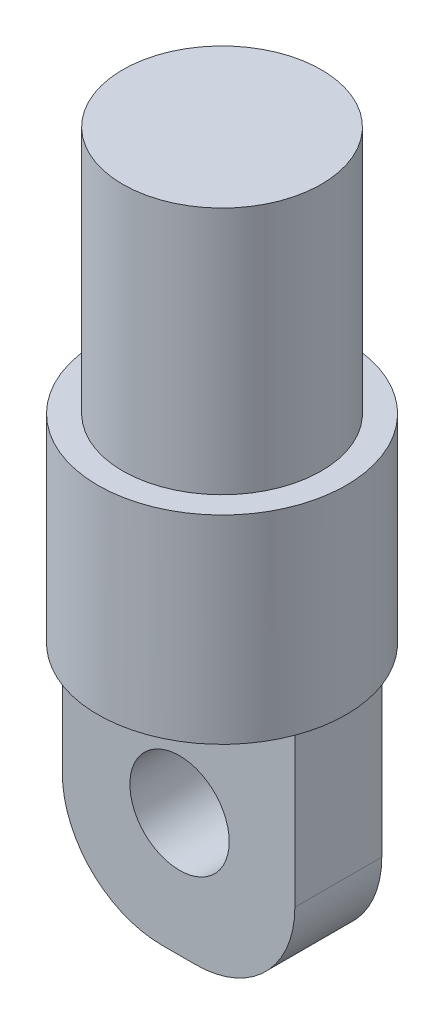
ISO-10303-21;
HEADER;
FILE_DESCRIPTION(('STEP AP214'),'2;1');
FILE_NAME('part.step','',(''),(''),'','','');
FILE_SCHEMA(('AUTOMOTIVE_DESIGN { 1 0 10303 214 1 1 1 1 }'));
ENDSEC;
DATA;
#1=APPLICATION_CONTEXT('core data for automotive mechanical design processes');
#2=APPLICATION_PROTOCOL_DEFINITION('international standard','automotive_design',2000,#1);
#3=PRODUCT_CONTEXT('',#1,'mechanical');
#4=PRODUCT('Part','Part','',(#3));
#5=PRODUCT_RELATED_PRODUCT_CATEGORY('part','',(#4));
#6=PRODUCT_DEFINITION_FORMATION('','',#4);
#7=PRODUCT_DEFINITION_CONTEXT('part definition',#1,'design');
#8=PRODUCT_DEFINITION('design','',#6,#7);
#9=PRODUCT_DEFINITION_SHAPE('','',#8);
#10=(LENGTH_UNIT() NAMED_UNIT(*) SI_UNIT(.MILLI.,.METRE.));
#11=(NAMED_UNIT(*) PLANE_ANGLE_UNIT() SI_UNIT($,.RADIAN.));
#12=(NAMED_UNIT(*) SI_UNIT($,.STERADIAN.) SOLID_ANGLE_UNIT());
#13=UNCERTAINTY_MEASURE_WITH_UNIT(LENGTH_MEASURE(1.E-05),#10,'distance_accuracy_value','');
#14=(GEOMETRIC_REPRESENTATION_CONTEXT(3) GLOBAL_UNCERTAINTY_ASSIGNED_CONTEXT((#13)) GLOBAL_UNIT_ASSIGNED_CONTEXT((#10,
#11,#12)) REPRESENTATION_CONTEXT('',''));
#15=CARTESIAN_POINT('',(0.,0.,0.));
#16=DIRECTION('',(0.,0.,1.));
#17=DIRECTION('',(1.,0.,0.));
#18=AXIS2_PLACEMENT_3D('',#15,#16,#17);
#19=CARTESIAN_POINT('',(0.,0.,0.));
#20=DIRECTION('',(0.,1.,0.));
#21=DIRECTION('',(0.,0.,1.));
#22=AXIS2_PLACEMENT_3D('',#19,#20,#21);
#23=PLANE('',#22);
#24=DIRECTION('',(0.,0.,1.));
#25=VECTOR('',#24,1.);
#26=CARTESIAN_POINT('',(29.7403777212003,0.,-11.1163138225011));
#27=LINE('',#26,#25);
#28=CARTESIAN_POINT('',(29.7403777212004,0.,-11.1163138225011));
#29=VERTEX_POINT('',#28);
#30=CARTESIAN_POINT('',(29.7403777212004,0.,11.1163138225011));
#31=VERTEX_POINT('',#30);
#32=EDGE_CURVE('E142',#29,#31,#27,.T.);
#33=ORIENTED_EDGE('',*,*,#32,.F.);
#34=CARTESIAN_POINT('',(0.,0.,0.));
#35=DIRECTION('',(0.,1.,0.));
#36=DIRECTION('',(0.,0.,1.));
#37=AXIS2_PLACEMENT_3D('',#34,#35,#36);
#38=CIRCLE('',#37,31.75);
#39=EDGE_CURVE('E135',#31,#29,#38,.T.);
#40=ORIENTED_EDGE('',*,*,#39,.F.);
#41=EDGE_LOOP('',(#33,#40));
#42=FACE_BOUND('',#41,.T.);
#43=ADVANCED_FACE('F47',(#42),#23,.F.);
#44=DIRECTION('',(1.,0.,0.));
#45=VECTOR('',#44,1.);
#46=CARTESIAN_POINT('',(-29.7403777212004,0.,-11.1163138225011));
#47=LINE('',#46,#45);
#48=CARTESIAN_POINT('',(-29.7403777212004,0.,-11.1163138225011));
#49=VERTEX_POINT('',#48);
#50=EDGE_CURVE('E138',#49,#29,#47,.T.);
#51=ORIENTED_EDGE('',*,*,#50,.F.);
#52=EDGE_CURVE('E125',#29,#49,#38,.T.);
#53=ORIENTED_EDGE('',*,*,#52,.F.);
#54=EDGE_LOOP('',(#51,#53));
#55=FACE_BOUND('',#54,.T.);
#56=ADVANCED_FACE('F223',(#55),#23,.F.);
#57=DIRECTION('',(0.,0.,-1.));
#58=VECTOR('',#57,1.);
#59=CARTESIAN_POINT('',(-29.7403777212004,0.,-11.1163138225011));
#60=LINE('',#59,#58);
#61=CARTESIAN_POINT('',(-29.7403777212004,0.,11.1163138225011));
#62=VERTEX_POINT('',#61);
#63=EDGE_CURVE('E104',#62,#49,#60,.T.);
#64=ORIENTED_EDGE('',*,*,#63,.F.);
#65=EDGE_CURVE('E118',#49,#62,#38,.T.);
#66=ORIENTED_EDGE('',*,*,#65,.F.);
#67=EDGE_LOOP('',(#64,#66));
#68=FACE_BOUND('',#67,.T.);
#69=ADVANCED_FACE('F136',(#68),#23,.F.);
#70=DIRECTION('',(-1.,0.,0.));
#71=VECTOR('',#70,1.);
#72=CARTESIAN_POINT('',(-29.7403777212004,0.,11.1163138225011));
#73=LINE('',#72,#71);
#74=EDGE_CURVE('E132',#31,#62,#73,.T.);
#75=ORIENTED_EDGE('',*,*,#74,.F.);
#76=EDGE_CURVE('E122',#62,#31,#38,.T.);
#77=ORIENTED_EDGE('',*,*,#76,.F.);
#78=EDGE_LOOP('',(#75,#77));
#79=FACE_BOUND('',#78,.T.);
#80=ADVANCED_FACE('F131',(#79),#23,.F.);
#81=CARTESIAN_POINT('',(0.,50.8,0.));
#82=DIRECTION('',(0.,-1.,0.));
#83=DIRECTION('',(0.,0.,-1.));
#84=AXIS2_PLACEMENT_3D('',#81,#82,#83);
#85=CYLINDRICAL_SURFACE('',#84,31.75);
#86=CARTESIAN_POINT('',(0.,50.8,0.));
#87=DIRECTION('',(0.,1.,0.));
#88=DIRECTION('',(0.,0.,1.));
#89=AXIS2_PLACEMENT_3D('',#86,#87,#88);
#90=CIRCLE('',#89,31.75);
#91=CARTESIAN_POINT('',(0.,50.8,31.75));
#92=VERTEX_POINT('',#91);
#93=EDGE_CURVE('E170',#92,#92,#90,.T.);
#94=ORIENTED_EDGE('',*,*,#93,.F.);
#95=EDGE_LOOP('',(#94));
#96=FACE_BOUND('',#95,.T.);
#97=ORIENTED_EDGE('',*,*,#39,.T.);
#98=ORIENTED_EDGE('',*,*,#52,.T.);
#99=ORIENTED_EDGE('',*,*,#65,.T.);
#100=ORIENTED_EDGE('',*,*,#76,.T.);
#101=EDGE_LOOP('',(#97,#98,#99,#100));
#102=FACE_BOUND('',#101,.T.);
#103=ADVANCED_FACE('F121',(#96,#102),#85,.T.);
#104=CARTESIAN_POINT('',(0.,50.8,0.));
#105=DIRECTION('',(0.,1.,0.));
#106=DIRECTION('',(0.,0.,1.));
#107=AXIS2_PLACEMENT_3D('',#104,#105,#106);
#108=PLANE('',#107);
#109=CARTESIAN_POINT('',(0.,50.8,0.));
#110=DIRECTION('',(0.,1.,0.));
#111=DIRECTION('',(0.,0.,1.));
#112=AXIS2_PLACEMENT_3D('',#109,#110,#111);
#113=CIRCLE('',#112,25.4);
#114=CARTESIAN_POINT('',(0.,50.8,25.4));
#115=VERTEX_POINT('',#114);
#116=EDGE_CURVE('E165',#115,#115,#113,.T.);
#117=ORIENTED_EDGE('',*,*,#116,.F.);
#118=EDGE_LOOP('',(#117));
#119=FACE_BOUND('',#118,.T.);
#120=ORIENTED_EDGE('',*,*,#93,.T.);
#121=EDGE_LOOP('',(#120));
#122=FACE_BOUND('',#121,.T.);
#123=ADVANCED_FACE('F239',(#119,#122),#108,.T.);
#124=CARTESIAN_POINT('',(0.,114.3,0.));
#125=DIRECTION('',(0.,-1.,0.));
#126=DIRECTION('',(0.,0.,-1.));
#127=AXIS2_PLACEMENT_3D('',#124,#125,#126);
#128=CYLINDRICAL_SURFACE('',#127,25.4);
#129=CARTESIAN_POINT('',(0.,114.3,0.));
#130=DIRECTION('',(0.,1.,0.));
#131=DIRECTION('',(0.,0.,1.));
#132=AXIS2_PLACEMENT_3D('',#129,#130,#131);
#133=CIRCLE('',#132,25.4);
#134=CARTESIAN_POINT('',(0.,114.3,25.4));
#135=VERTEX_POINT('',#134);
#136=EDGE_CURVE('E134',#135,#135,#133,.T.);
#137=ORIENTED_EDGE('',*,*,#136,.F.);
#138=EDGE_LOOP('',(#137));
#139=FACE_BOUND('',#138,.T.);
#140=ORIENTED_EDGE('',*,*,#116,.T.);
#141=EDGE_LOOP('',(#140));
#142=FACE_BOUND('',#141,.T.);
#143=ADVANCED_FACE('F331',(#139,#142),#128,.T.);
#144=CARTESIAN_POINT('',(0.,114.3,0.));
#145=DIRECTION('',(0.,1.,0.));
#146=DIRECTION('',(0.,0.,1.));
#147=AXIS2_PLACEMENT_3D('',#144,#145,#146);
#148=PLANE('',#147);
#149=ORIENTED_EDGE('',*,*,#136,.T.);
#150=EDGE_LOOP('',(#149));
#151=FACE_BOUND('',#150,.T.);
#152=ADVANCED_FACE('F220',(#151),#148,.T.);
#153=CARTESIAN_POINT('',(29.7403777212003,-63.5,-11.1163138225011));
#154=DIRECTION('',(-1.,0.,0.));
#155=DIRECTION('',(0.,0.,1.));
#156=AXIS2_PLACEMENT_3D('',#153,#154,#155);
#157=PLANE('',#156);
#158=DIRECTION('',(0.,1.,0.));
#159=VECTOR('',#158,1.);
#160=CARTESIAN_POINT('',(29.7403777212003,-63.5,11.1163138225011));
#161=LINE('',#160,#159);
#162=CARTESIAN_POINT('',(29.7403777212003,-38.1,11.1163138225011));
#163=VERTEX_POINT('',#162);
#164=EDGE_CURVE('E111',#163,#31,#161,.T.);
#165=ORIENTED_EDGE('',*,*,#164,.F.);
#166=DIRECTION('',(0.,0.,1.));
#167=VECTOR('',#166,1.);
#168=CARTESIAN_POINT('',(29.7403777212003,-38.1,-11.1163138225011));
#169=LINE('',#168,#167);
#170=CARTESIAN_POINT('',(29.7403777212003,-38.1,-11.1163138225011));
#171=VERTEX_POINT('',#170);
#172=EDGE_CURVE('E56',#163,#171,#169,.F.);
#173=ORIENTED_EDGE('',*,*,#172,.T.);
#174=DIRECTION('',(0.,1.,0.));
#175=VECTOR('',#174,1.);
#176=CARTESIAN_POINT('',(29.7403777212003,-63.5,-11.1163138225011));
#177=LINE('',#176,#175);
#178=EDGE_CURVE('E154',#171,#29,#177,.T.);
#179=ORIENTED_EDGE('',*,*,#178,.T.);
#180=ORIENTED_EDGE('',*,*,#32,.T.);
#181=EDGE_LOOP('',(#165,#173,#179,#180));
#182=FACE_BOUND('',#181,.T.);
#183=ADVANCED_FACE('F211',(#182),#157,.F.);
#184=CARTESIAN_POINT('',(-29.7403777212004,-63.5,11.1163138225011));
#185=DIRECTION('',(0.,0.,-1.));
#186=DIRECTION('',(-1.,0.,0.));
#187=AXIS2_PLACEMENT_3D('',#184,#185,#186);
#188=PLANE('',#187);
#189=CARTESIAN_POINT('',(0.243990195886043,-31.9670642886024,11.1163138225011));
#190=DIRECTION('',(0.,0.,1.));
#191=DIRECTION('',(1.,0.,0.));
#192=AXIS2_PLACEMENT_3D('',#189,#190,#191);
#193=CIRCLE('',#192,12.7);
#194=CARTESIAN_POINT('',(12.943990195886,-31.9670642886024,11.1163138225011));
#195=VERTEX_POINT('',#194);
#196=EDGE_CURVE('E178',#195,#195,#193,.T.);
#197=ORIENTED_EDGE('',*,*,#196,.F.);
#198=EDGE_LOOP('',(#197));
#199=FACE_BOUND('',#198,.T.);
#200=DIRECTION('',(-1.,0.,0.));
#201=VECTOR('',#200,1.);
#202=CARTESIAN_POINT('',(-29.7403777212004,-63.5,11.1163138225011));
#203=LINE('',#202,#201);
#204=CARTESIAN_POINT('',(4.34037772120035,-63.5,11.1163138225011));
#205=VERTEX_POINT('',#204);
#206=CARTESIAN_POINT('',(-4.34037772120036,-63.5,11.1163138225011));
#207=VERTEX_POINT('',#206);
#208=EDGE_CURVE('E153',#205,#207,#203,.T.);
#209=ORIENTED_EDGE('',*,*,#208,.F.);
#210=CARTESIAN_POINT('',(4.34037772120035,-38.1,11.1163138225011));
#211=DIRECTION('',(0.,0.,-1.));
#212=DIRECTION('',(-1.,0.,0.));
#213=AXIS2_PLACEMENT_3D('',#210,#211,#212);
#214=CIRCLE('',#213,25.4);
#215=EDGE_CURVE('E70',#205,#163,#214,.F.);
#216=ORIENTED_EDGE('',*,*,#215,.T.);
#217=ORIENTED_EDGE('',*,*,#164,.T.);
#218=ORIENTED_EDGE('',*,*,#74,.T.);
#219=DIRECTION('',(0.,1.,0.));
#220=VECTOR('',#219,1.);
#221=CARTESIAN_POINT('',(-29.7403777212004,-63.5,11.1163138225011));
#222=LINE('',#221,#220);
#223=CARTESIAN_POINT('',(-29.7403777212004,-38.1,11.1163138225011));
#224=VERTEX_POINT('',#223);
#225=EDGE_CURVE('E99',#224,#62,#222,.T.);
#226=ORIENTED_EDGE('',*,*,#225,.F.);
#227=CARTESIAN_POINT('',(-4.34037772120036,-38.1,11.1163138225011));
#228=DIRECTION('',(0.,0.,-1.));
#229=DIRECTION('',(-1.,0.,0.));
#230=AXIS2_PLACEMENT_3D('',#227,#228,#229);
#231=CIRCLE('',#230,25.4);
#232=EDGE_CURVE('E187',#224,#207,#231,.F.);
#233=ORIENTED_EDGE('',*,*,#232,.T.);
#234=EDGE_LOOP('',(#209,#216,#217,#218,#226,#233));
#235=FACE_BOUND('',#234,.T.);
#236=ADVANCED_FACE('F140',(#199,#235),#188,.F.);
#237=CARTESIAN_POINT('',(-29.7403777212004,-63.5,-11.1163138225011));
#238=DIRECTION('',(1.,0.,0.));
#239=DIRECTION('',(0.,0.,-1.));
#240=AXIS2_PLACEMENT_3D('',#237,#238,#239);
#241=PLANE('',#240);
#242=DIRECTION('',(0.,1.,0.));
#243=VECTOR('',#242,1.);
#244=CARTESIAN_POINT('',(-29.7403777212004,-63.5,-11.1163138225011));
#245=LINE('',#244,#243);
#246=CARTESIAN_POINT('',(-29.7403777212004,-38.1,-11.1163138225011));
#247=VERTEX_POINT('',#246);
#248=EDGE_CURVE('E112',#247,#49,#245,.T.);
#249=ORIENTED_EDGE('',*,*,#248,.F.);
#250=DIRECTION('',(0.,0.,-1.));
#251=VECTOR('',#250,1.);
#252=CARTESIAN_POINT('',(-29.7403777212004,-38.1,-11.1163138225011));
#253=LINE('',#252,#251);
#254=EDGE_CURVE('E106',#247,#224,#253,.F.);
#255=ORIENTED_EDGE('',*,*,#254,.T.);
#256=ORIENTED_EDGE('',*,*,#225,.T.);
#257=ORIENTED_EDGE('',*,*,#63,.T.);
#258=EDGE_LOOP('',(#249,#255,#256,#257));
#259=FACE_BOUND('',#258,.T.);
#260=ADVANCED_FACE('F102',(#259),#241,.F.);
#261=CARTESIAN_POINT('',(-29.7403777212004,-63.5,-11.1163138225011));
#262=DIRECTION('',(0.,0.,1.));
#263=DIRECTION('',(1.,0.,0.));
#264=AXIS2_PLACEMENT_3D('',#261,#262,#263);
#265=PLANE('',#264);
#266=CARTESIAN_POINT('',(0.243990195886043,-31.9670642886024,-11.1163138225011));
#267=DIRECTION('',(0.,0.,1.));
#268=DIRECTION('',(1.,0.,0.));
#269=AXIS2_PLACEMENT_3D('',#266,#267,#268);
#270=CIRCLE('',#269,12.7);
#271=CARTESIAN_POINT('',(12.943990195886,-31.9670642886024,-11.1163138225011));
#272=VERTEX_POINT('',#271);
#273=EDGE_CURVE('E146',#272,#272,#270,.T.);
#274=ORIENTED_EDGE('',*,*,#273,.T.);
#275=EDGE_LOOP('',(#274));
#276=FACE_BOUND('',#275,.T.);
#277=ORIENTED_EDGE('',*,*,#178,.F.);
#278=CARTESIAN_POINT('',(4.34037772120035,-38.1,-11.1163138225011));
#279=DIRECTION('',(0.,0.,1.));
#280=DIRECTION('',(1.,0.,0.));
#281=AXIS2_PLACEMENT_3D('',#278,#279,#280);
#282=CIRCLE('',#281,25.4);
#283=CARTESIAN_POINT('',(4.34037772120035,-63.5,-11.1163138225011));
#284=VERTEX_POINT('',#283);
#285=EDGE_CURVE('E11',#171,#284,#282,.F.);
#286=ORIENTED_EDGE('',*,*,#285,.T.);
#287=DIRECTION('',(1.,0.,0.));
#288=VECTOR('',#287,1.);
#289=CARTESIAN_POINT('',(-29.7403777212004,-63.5,-11.1163138225011));
#290=LINE('',#289,#288);
#291=CARTESIAN_POINT('',(-4.34037772120036,-63.5,-11.1163138225011));
#292=VERTEX_POINT('',#291);
#293=EDGE_CURVE('E157',#292,#284,#290,.T.);
#294=ORIENTED_EDGE('',*,*,#293,.F.);
#295=CARTESIAN_POINT('',(-4.34037772120036,-38.1,-11.1163138225011));
#296=DIRECTION('',(0.,0.,1.));
#297=DIRECTION('',(1.,0.,0.));
#298=AXIS2_PLACEMENT_3D('',#295,#296,#297);
#299=CIRCLE('',#298,25.4);
#300=EDGE_CURVE('E182',#292,#247,#299,.F.);
#301=ORIENTED_EDGE('',*,*,#300,.T.);
#302=ORIENTED_EDGE('',*,*,#248,.T.);
#303=ORIENTED_EDGE('',*,*,#50,.T.);
#304=EDGE_LOOP('',(#277,#286,#294,#301,#302,#303));
#305=FACE_BOUND('',#304,.T.);
#306=ADVANCED_FACE('F218',(#276,#305),#265,.F.);
#307=CARTESIAN_POINT('',(0.,-63.5,0.));
#308=DIRECTION('',(0.,1.,0.));
#309=DIRECTION('',(0.,0.,1.));
#310=AXIS2_PLACEMENT_3D('',#307,#308,#309);
#311=PLANE('',#310);
#312=ORIENTED_EDGE('',*,*,#293,.T.);
#313=DIRECTION('',(0.,0.,1.));
#314=VECTOR('',#313,1.);
#315=CARTESIAN_POINT('',(4.34037772120035,-63.5,0.));
#316=LINE('',#315,#314);
#317=EDGE_CURVE('E190',#284,#205,#316,.T.);
#318=ORIENTED_EDGE('',*,*,#317,.T.);
#319=ORIENTED_EDGE('',*,*,#208,.T.);
#320=DIRECTION('',(0.,0.,-1.));
#321=VECTOR('',#320,1.);
#322=CARTESIAN_POINT('',(-4.34037772120036,-63.5,0.));
#323=LINE('',#322,#321);
#324=EDGE_CURVE('E169',#207,#292,#323,.T.);
#325=ORIENTED_EDGE('',*,*,#324,.T.);
#326=EDGE_LOOP('',(#312,#318,#319,#325));
#327=FACE_BOUND('',#326,.T.);
#328=ADVANCED_FACE('F273',(#327),#311,.F.);
#329=CARTESIAN_POINT('',(0.243990195886043,-31.9670642886024,-31.75));
#330=DIRECTION('',(0.,0.,1.));
#331=DIRECTION('',(1.,0.,0.));
#332=AXIS2_PLACEMENT_3D('',#329,#330,#331);
#333=CYLINDRICAL_SURFACE('',#332,12.7);
#334=ORIENTED_EDGE('',*,*,#196,.T.);
#335=EDGE_LOOP('',(#334));
#336=FACE_BOUND('',#335,.T.);
#337=ORIENTED_EDGE('',*,*,#273,.F.);
#338=EDGE_LOOP('',(#337));
#339=FACE_BOUND('',#338,.T.);
#340=ADVANCED_FACE('F207',(#336,#339),#333,.F.);
#341=CARTESIAN_POINT('',(-4.34037772120036,-38.1,0.));
#342=DIRECTION('',(0.,0.,-1.));
#343=DIRECTION('',(-1.,0.,0.));
#344=AXIS2_PLACEMENT_3D('',#341,#342,#343);
#345=CYLINDRICAL_SURFACE('',#344,25.4);
#346=ORIENTED_EDGE('',*,*,#232,.F.);
#347=ORIENTED_EDGE('',*,*,#254,.F.);
#348=ORIENTED_EDGE('',*,*,#300,.F.);
#349=ORIENTED_EDGE('',*,*,#324,.F.);
#350=EDGE_LOOP('',(#346,#347,#348,#349));
#351=FACE_BOUND('',#350,.T.);
#352=ADVANCED_FACE('F289',(#351),#345,.T.);
#353=CARTESIAN_POINT('',(4.34037772120035,-38.1,0.));
#354=DIRECTION('',(0.,0.,1.));
#355=DIRECTION('',(1.,0.,0.));
#356=AXIS2_PLACEMENT_3D('',#353,#354,#355);
#357=CYLINDRICAL_SURFACE('',#356,25.4);
#358=ORIENTED_EDGE('',*,*,#285,.F.);
#359=ORIENTED_EDGE('',*,*,#172,.F.);
#360=ORIENTED_EDGE('',*,*,#215,.F.);
#361=ORIENTED_EDGE('',*,*,#317,.F.);
#362=EDGE_LOOP('',(#358,#359,#360,#361));
#363=FACE_BOUND('',#362,.T.);
#364=ADVANCED_FACE('F49',(#363),#357,.T.);
#365=CLOSED_SHELL('',(#43,#56,#69,#80,#103,#123,#143,#152,#183,#236,#260,#306,#328,#340,#352,#364));
#366=MANIFOLD_SOLID_BREP('B2',#365);
#367=ADVANCED_BREP_SHAPE_REPRESENTATION('',(#18,#366),#14);
#368=SHAPE_DEFINITION_REPRESENTATION(#9,#367);
ENDSEC;
END-ISO-10303-21;
